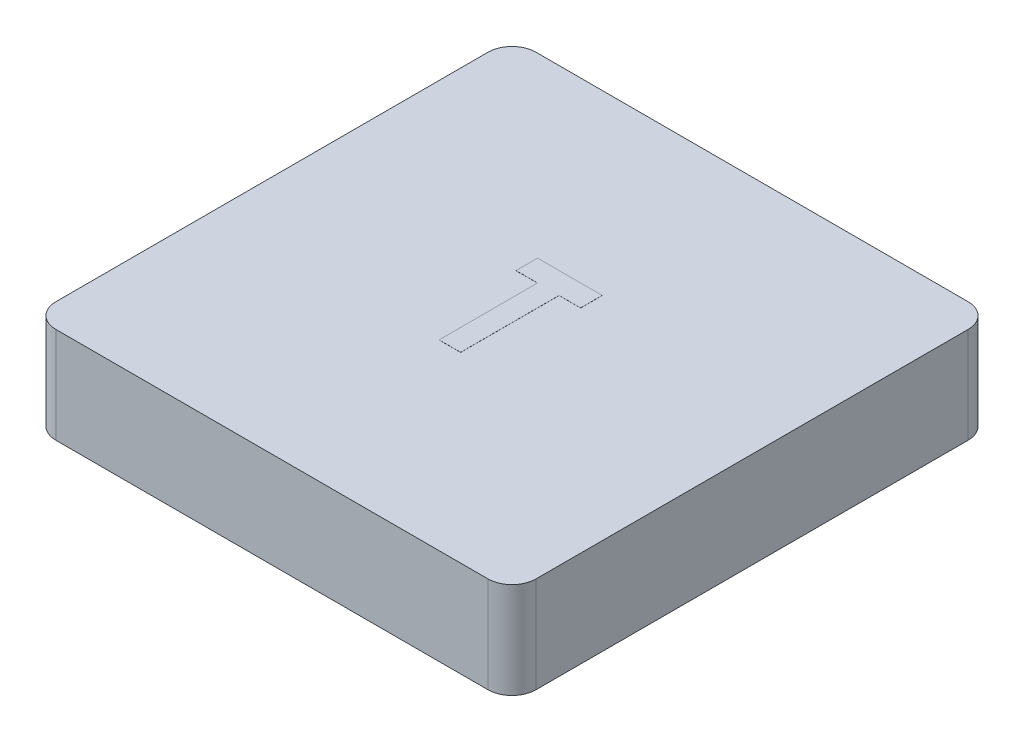
ISO-10303-21;
HEADER;
FILE_DESCRIPTION(('STEP AP214'),'2;1');
FILE_NAME('part.step','',(''),(''),'','','');
FILE_SCHEMA(('AUTOMOTIVE_DESIGN { 1 0 10303 214 1 1 1 1 }'));
ENDSEC;
DATA;
#1=APPLICATION_CONTEXT('core data for automotive mechanical design processes');
#2=APPLICATION_PROTOCOL_DEFINITION('international standard','automotive_design',2000,#1);
#3=PRODUCT_CONTEXT('',#1,'mechanical');
#4=PRODUCT('Part','Part','',(#3));
#5=PRODUCT_RELATED_PRODUCT_CATEGORY('part','',(#4));
#6=PRODUCT_DEFINITION_FORMATION('','',#4);
#7=PRODUCT_DEFINITION_CONTEXT('part definition',#1,'design');
#8=PRODUCT_DEFINITION('design','',#6,#7);
#9=PRODUCT_DEFINITION_SHAPE('','',#8);
#10=(LENGTH_UNIT() NAMED_UNIT(*) SI_UNIT(.MILLI.,.METRE.));
#11=(NAMED_UNIT(*) PLANE_ANGLE_UNIT() SI_UNIT($,.RADIAN.));
#12=(NAMED_UNIT(*) SI_UNIT($,.STERADIAN.) SOLID_ANGLE_UNIT());
#13=UNCERTAINTY_MEASURE_WITH_UNIT(LENGTH_MEASURE(1.E-05),#10,'distance_accuracy_value','');
#14=(GEOMETRIC_REPRESENTATION_CONTEXT(3) GLOBAL_UNCERTAINTY_ASSIGNED_CONTEXT((#13)) GLOBAL_UNIT_ASSIGNED_CONTEXT((#10,
#11,#12)) REPRESENTATION_CONTEXT('',''));
#15=CARTESIAN_POINT('',(0.,0.,0.));
#16=DIRECTION('',(0.,0.,1.));
#17=DIRECTION('',(1.,0.,0.));
#18=AXIS2_PLACEMENT_3D('',#15,#16,#17);
#19=CARTESIAN_POINT('',(0.,2.54,-12.7));
#20=DIRECTION('',(1.,0.,0.));
#21=DIRECTION('',(0.,0.,-1.));
#22=AXIS2_PLACEMENT_3D('',#19,#20,#21);
#23=PLANE('',#22);
#24=DIRECTION('',(0.,0.,1.));
#25=VECTOR('',#24,1.);
#26=CARTESIAN_POINT('',(0.,2.54,-12.7));
#27=LINE('',#26,#25);
#28=CARTESIAN_POINT('',(0.,2.54,-12.065));
#29=VERTEX_POINT('',#28);
#30=CARTESIAN_POINT('',(0.,2.54,-0.635));
#31=VERTEX_POINT('',#30);
#32=EDGE_CURVE('E280',#29,#31,#27,.T.);
#33=ORIENTED_EDGE('',*,*,#32,.F.);
#34=DIRECTION('',(0.,-1.,0.));
#35=VECTOR('',#34,1.);
#36=CARTESIAN_POINT('',(0.,2.54,-12.065));
#37=LINE('',#36,#35);
#38=CARTESIAN_POINT('',(0.,0.,-12.065));
#39=VERTEX_POINT('',#38);
#40=EDGE_CURVE('E305',#29,#39,#37,.T.);
#41=ORIENTED_EDGE('',*,*,#40,.T.);
#42=DIRECTION('',(0.,0.,1.));
#43=VECTOR('',#42,1.);
#44=CARTESIAN_POINT('',(0.,0.,-12.7));
#45=LINE('',#44,#43);
#46=CARTESIAN_POINT('',(0.,0.,-0.635));
#47=VERTEX_POINT('',#46);
#48=EDGE_CURVE('E260',#39,#47,#45,.T.);
#49=ORIENTED_EDGE('',*,*,#48,.T.);
#50=DIRECTION('',(0.,-1.,0.));
#51=VECTOR('',#50,1.);
#52=CARTESIAN_POINT('',(0.,2.54,-0.635));
#53=LINE('',#52,#51);
#54=EDGE_CURVE('E293',#47,#31,#53,.F.);
#55=ORIENTED_EDGE('',*,*,#54,.T.);
#56=EDGE_LOOP('',(#33,#41,#49,#55));
#57=FACE_BOUND('',#56,.T.);
#58=ADVANCED_FACE('F33',(#57),#23,.F.);
#59=CARTESIAN_POINT('',(0.,2.54,0.));
#60=DIRECTION('',(0.,0.,-1.));
#61=DIRECTION('',(-1.,0.,0.));
#62=AXIS2_PLACEMENT_3D('',#59,#60,#61);
#63=PLANE('',#62);
#64=DIRECTION('',(1.,0.,0.));
#65=VECTOR('',#64,1.);
#66=CARTESIAN_POINT('',(0.,0.,0.));
#67=LINE('',#66,#65);
#68=CARTESIAN_POINT('',(0.635,0.,0.));
#69=VERTEX_POINT('',#68);
#70=CARTESIAN_POINT('',(12.065,0.,0.));
#71=VERTEX_POINT('',#70);
#72=EDGE_CURVE('E296',#69,#71,#67,.T.);
#73=ORIENTED_EDGE('',*,*,#72,.T.);
#74=DIRECTION('',(0.,-1.,0.));
#75=VECTOR('',#74,1.);
#76=CARTESIAN_POINT('',(12.065,2.54,0.));
#77=LINE('',#76,#75);
#78=CARTESIAN_POINT('',(12.065,2.54,0.));
#79=VERTEX_POINT('',#78);
#80=EDGE_CURVE('E41',#71,#79,#77,.F.);
#81=ORIENTED_EDGE('',*,*,#80,.T.);
#82=DIRECTION('',(1.,0.,0.));
#83=VECTOR('',#82,1.);
#84=CARTESIAN_POINT('',(0.,2.54,0.));
#85=LINE('',#84,#83);
#86=CARTESIAN_POINT('',(0.635,2.54,0.));
#87=VERTEX_POINT('',#86);
#88=EDGE_CURVE('E283',#87,#79,#85,.T.);
#89=ORIENTED_EDGE('',*,*,#88,.F.);
#90=DIRECTION('',(0.,-1.,0.));
#91=VECTOR('',#90,1.);
#92=CARTESIAN_POINT('',(0.635,2.54,0.));
#93=LINE('',#92,#91);
#94=EDGE_CURVE('E334',#87,#69,#93,.T.);
#95=ORIENTED_EDGE('',*,*,#94,.T.);
#96=EDGE_LOOP('',(#73,#81,#89,#95));
#97=FACE_BOUND('',#96,.T.);
#98=ADVANCED_FACE('F339',(#97),#63,.F.);
#99=CARTESIAN_POINT('',(12.7,2.54,0.));
#100=DIRECTION('',(-1.,0.,0.));
#101=DIRECTION('',(0.,0.,1.));
#102=AXIS2_PLACEMENT_3D('',#99,#100,#101);
#103=PLANE('',#102);
#104=DIRECTION('',(0.,0.,-1.));
#105=VECTOR('',#104,1.);
#106=CARTESIAN_POINT('',(12.7,0.,0.));
#107=LINE('',#106,#105);
#108=CARTESIAN_POINT('',(12.7,0.,-0.635));
#109=VERTEX_POINT('',#108);
#110=CARTESIAN_POINT('',(12.7,0.,-12.065));
#111=VERTEX_POINT('',#110);
#112=EDGE_CURVE('E299',#109,#111,#107,.T.);
#113=ORIENTED_EDGE('',*,*,#112,.T.);
#114=DIRECTION('',(0.,-1.,0.));
#115=VECTOR('',#114,1.);
#116=CARTESIAN_POINT('',(12.7,2.54,-12.065));
#117=LINE('',#116,#115);
#118=CARTESIAN_POINT('',(12.7,2.54,-12.065));
#119=VERTEX_POINT('',#118);
#120=EDGE_CURVE('E332',#111,#119,#117,.F.);
#121=ORIENTED_EDGE('',*,*,#120,.T.);
#122=DIRECTION('',(0.,0.,-1.));
#123=VECTOR('',#122,1.);
#124=CARTESIAN_POINT('',(12.7,2.54,0.));
#125=LINE('',#124,#123);
#126=CARTESIAN_POINT('',(12.7,2.54,-0.635));
#127=VERTEX_POINT('',#126);
#128=EDGE_CURVE('E287',#127,#119,#125,.T.);
#129=ORIENTED_EDGE('',*,*,#128,.F.);
#130=DIRECTION('',(0.,-1.,0.));
#131=VECTOR('',#130,1.);
#132=CARTESIAN_POINT('',(12.7,2.54,-0.635));
#133=LINE('',#132,#131);
#134=EDGE_CURVE('E329',#127,#109,#133,.T.);
#135=ORIENTED_EDGE('',*,*,#134,.T.);
#136=EDGE_LOOP('',(#113,#121,#129,#135));
#137=FACE_BOUND('',#136,.T.);
#138=ADVANCED_FACE('F352',(#137),#103,.F.);
#139=CARTESIAN_POINT('',(12.7,2.54,-12.7));
#140=DIRECTION('',(0.,0.,1.));
#141=DIRECTION('',(1.,0.,0.));
#142=AXIS2_PLACEMENT_3D('',#139,#140,#141);
#143=PLANE('',#142);
#144=DIRECTION('',(-1.,0.,0.));
#145=VECTOR('',#144,1.);
#146=CARTESIAN_POINT('',(12.7,0.,-12.7));
#147=LINE('',#146,#145);
#148=CARTESIAN_POINT('',(12.065,0.,-12.7));
#149=VERTEX_POINT('',#148);
#150=CARTESIAN_POINT('',(0.634999999999995,0.,-12.7));
#151=VERTEX_POINT('',#150);
#152=EDGE_CURVE('E284',#149,#151,#147,.T.);
#153=ORIENTED_EDGE('',*,*,#152,.T.);
#154=DIRECTION('',(0.,-1.,0.));
#155=VECTOR('',#154,1.);
#156=CARTESIAN_POINT('',(0.634999999999995,2.54,-12.7));
#157=LINE('',#156,#155);
#158=CARTESIAN_POINT('',(0.634999999999995,2.54,-12.7));
#159=VERTEX_POINT('',#158);
#160=EDGE_CURVE('E319',#151,#159,#157,.F.);
#161=ORIENTED_EDGE('',*,*,#160,.T.);
#162=DIRECTION('',(-1.,0.,0.));
#163=VECTOR('',#162,1.);
#164=CARTESIAN_POINT('',(12.7,2.54,-12.7));
#165=LINE('',#164,#163);
#166=CARTESIAN_POINT('',(12.065,2.54,-12.7));
#167=VERTEX_POINT('',#166);
#168=EDGE_CURVE('E290',#167,#159,#165,.T.);
#169=ORIENTED_EDGE('',*,*,#168,.F.);
#170=DIRECTION('',(0.,-1.,0.));
#171=VECTOR('',#170,1.);
#172=CARTESIAN_POINT('',(12.065,2.54,-12.7));
#173=LINE('',#172,#171);
#174=EDGE_CURVE('E316',#167,#149,#173,.T.);
#175=ORIENTED_EDGE('',*,*,#174,.T.);
#176=EDGE_LOOP('',(#153,#161,#169,#175));
#177=FACE_BOUND('',#176,.T.);
#178=ADVANCED_FACE('F364',(#177),#143,.F.);
#179=CARTESIAN_POINT('',(0.,2.54,0.));
#180=DIRECTION('',(0.,1.,0.));
#181=DIRECTION('',(0.,0.,1.));
#182=AXIS2_PLACEMENT_3D('',#179,#180,#181);
#183=PLANE('',#182);
#184=DIRECTION('',(0.,0.,-1.));
#185=VECTOR('',#184,1.);
#186=CARTESIAN_POINT('',(5.37470512820512,2.54,-7.4311282051282));
#187=LINE('',#186,#185);
#188=CARTESIAN_POINT('',(5.37470512820512,2.54,-7.4311282051282));
#189=VERTEX_POINT('',#188);
#190=CARTESIAN_POINT('',(5.37470512820512,2.54,-8.001));
#191=VERTEX_POINT('',#190);
#192=EDGE_CURVE('E212',#189,#191,#187,.T.);
#193=ORIENTED_EDGE('',*,*,#192,.T.);
#194=DIRECTION('',(1.,0.,0.));
#195=VECTOR('',#194,1.);
#196=CARTESIAN_POINT('',(5.37470512820512,2.54,-8.001));
#197=LINE('',#196,#195);
#198=CARTESIAN_POINT('',(7.08432051282051,2.54,-8.001));
#199=VERTEX_POINT('',#198);
#200=EDGE_CURVE('E175',#191,#199,#197,.T.);
#201=ORIENTED_EDGE('',*,*,#200,.T.);
#202=DIRECTION('',(0.,0.,1.));
#203=VECTOR('',#202,1.);
#204=CARTESIAN_POINT('',(7.08432051282051,2.54,-8.001));
#205=LINE('',#204,#203);
#206=CARTESIAN_POINT('',(7.08432051282051,2.54,-7.4311282051282));
#207=VERTEX_POINT('',#206);
#208=EDGE_CURVE('E215',#199,#207,#205,.T.);
#209=ORIENTED_EDGE('',*,*,#208,.T.);
#210=DIRECTION('',(-1.,0.,0.));
#211=VECTOR('',#210,1.);
#212=CARTESIAN_POINT('',(7.08432051282051,2.54,-7.4311282051282));
#213=LINE('',#212,#211);
#214=CARTESIAN_POINT('',(6.51444871794871,2.54,-7.4311282051282));
#215=VERTEX_POINT('',#214);
#216=EDGE_CURVE('E217',#207,#215,#213,.T.);
#217=ORIENTED_EDGE('',*,*,#216,.T.);
#218=DIRECTION('',(0.,0.,1.));
#219=VECTOR('',#218,1.);
#220=CARTESIAN_POINT('',(6.51444871794871,2.54,-7.4311282051282));
#221=LINE('',#220,#219);
#222=CARTESIAN_POINT('',(6.51444871794871,2.54,-4.826));
#223=VERTEX_POINT('',#222);
#224=EDGE_CURVE('E219',#215,#223,#221,.T.);
#225=ORIENTED_EDGE('',*,*,#224,.T.);
#226=DIRECTION('',(-1.,0.,0.));
#227=VECTOR('',#226,1.);
#228=CARTESIAN_POINT('',(6.51444871794871,2.54,-4.826));
#229=LINE('',#228,#227);
#230=CARTESIAN_POINT('',(5.94457692307692,2.54,-4.826));
#231=VERTEX_POINT('',#230);
#232=EDGE_CURVE('E221',#223,#231,#229,.T.);
#233=ORIENTED_EDGE('',*,*,#232,.T.);
#234=DIRECTION('',(0.,0.,-1.));
#235=VECTOR('',#234,1.);
#236=CARTESIAN_POINT('',(5.94457692307692,2.54,-4.826));
#237=LINE('',#236,#235);
#238=CARTESIAN_POINT('',(5.94457692307692,2.54,-7.4311282051282));
#239=VERTEX_POINT('',#238);
#240=EDGE_CURVE('E53',#231,#239,#237,.T.);
#241=ORIENTED_EDGE('',*,*,#240,.T.);
#242=DIRECTION('',(-1.,0.,0.));
#243=VECTOR('',#242,1.);
#244=CARTESIAN_POINT('',(5.94457692307692,2.54,-7.4311282051282));
#245=LINE('',#244,#243);
#246=EDGE_CURVE('E48',#239,#189,#245,.T.);
#247=ORIENTED_EDGE('',*,*,#246,.T.);
#248=EDGE_LOOP('',(#193,#201,#209,#217,#225,#233,#241,#247));
#249=FACE_BOUND('',#248,.T.);
#250=ORIENTED_EDGE('',*,*,#168,.T.);
#251=CARTESIAN_POINT('',(0.634999999999995,2.54,-12.065));
#252=DIRECTION('',(0.,1.,0.));
#253=DIRECTION('',(0.,0.,1.));
#254=AXIS2_PLACEMENT_3D('',#251,#252,#253);
#255=CIRCLE('',#254,0.635);
#256=EDGE_CURVE('E327',#159,#29,#255,.T.);
#257=ORIENTED_EDGE('',*,*,#256,.T.);
#258=ORIENTED_EDGE('',*,*,#32,.T.);
#259=CARTESIAN_POINT('',(0.635,2.54,-0.635));
#260=DIRECTION('',(0.,1.,0.));
#261=DIRECTION('',(0.,0.,1.));
#262=AXIS2_PLACEMENT_3D('',#259,#260,#261);
#263=CIRCLE('',#262,0.635);
#264=EDGE_CURVE('E321',#31,#87,#263,.T.);
#265=ORIENTED_EDGE('',*,*,#264,.T.);
#266=ORIENTED_EDGE('',*,*,#88,.T.);
#267=CARTESIAN_POINT('',(12.065,2.54,-0.635));
#268=DIRECTION('',(0.,1.,0.));
#269=DIRECTION('',(0.,0.,1.));
#270=AXIS2_PLACEMENT_3D('',#267,#268,#269);
#271=CIRCLE('',#270,0.635);
#272=EDGE_CURVE('E323',#79,#127,#271,.T.);
#273=ORIENTED_EDGE('',*,*,#272,.T.);
#274=ORIENTED_EDGE('',*,*,#128,.T.);
#275=CARTESIAN_POINT('',(12.065,2.54,-12.065));
#276=DIRECTION('',(0.,1.,0.));
#277=DIRECTION('',(0.,0.,1.));
#278=AXIS2_PLACEMENT_3D('',#275,#276,#277);
#279=CIRCLE('',#278,0.635);
#280=EDGE_CURVE('E325',#119,#167,#279,.T.);
#281=ORIENTED_EDGE('',*,*,#280,.T.);
#282=EDGE_LOOP('',(#250,#257,#258,#265,#266,#273,#274,#281));
#283=FACE_BOUND('',#282,.T.);
#284=ADVANCED_FACE('F345',(#249,#283),#183,.T.);
#285=CARTESIAN_POINT('',(0.,0.,0.));
#286=DIRECTION('',(0.,1.,0.));
#287=DIRECTION('',(0.,0.,1.));
#288=AXIS2_PLACEMENT_3D('',#285,#286,#287);
#289=PLANE('',#288);
#290=DIRECTION('',(-1.,0.,0.));
#291=VECTOR('',#290,1.);
#292=CARTESIAN_POINT('',(12.7,0.,-12.065));
#293=LINE('',#292,#291);
#294=CARTESIAN_POINT('',(12.065,0.,-12.065));
#295=VERTEX_POINT('',#294);
#296=CARTESIAN_POINT('',(0.634999999999995,0.,-12.065));
#297=VERTEX_POINT('',#296);
#298=EDGE_CURVE('E248',#295,#297,#293,.T.);
#299=ORIENTED_EDGE('',*,*,#298,.T.);
#300=DIRECTION('',(0.,0.,1.));
#301=VECTOR('',#300,1.);
#302=CARTESIAN_POINT('',(0.634999999999995,0.,-12.7));
#303=LINE('',#302,#301);
#304=CARTESIAN_POINT('',(0.635,0.,-0.635));
#305=VERTEX_POINT('',#304);
#306=EDGE_CURVE('E243',#297,#305,#303,.T.);
#307=ORIENTED_EDGE('',*,*,#306,.T.);
#308=DIRECTION('',(1.,0.,0.));
#309=VECTOR('',#308,1.);
#310=CARTESIAN_POINT('',(0.,0.,-0.635));
#311=LINE('',#310,#309);
#312=CARTESIAN_POINT('',(12.065,0.,-0.635));
#313=VERTEX_POINT('',#312);
#314=EDGE_CURVE('E272',#305,#313,#311,.T.);
#315=ORIENTED_EDGE('',*,*,#314,.T.);
#316=DIRECTION('',(0.,0.,-1.));
#317=VECTOR('',#316,1.);
#318=CARTESIAN_POINT('',(12.065,0.,0.));
#319=LINE('',#318,#317);
#320=EDGE_CURVE('E275',#313,#295,#319,.T.);
#321=ORIENTED_EDGE('',*,*,#320,.T.);
#322=EDGE_LOOP('',(#299,#307,#315,#321));
#323=FACE_BOUND('',#322,.T.);
#324=ORIENTED_EDGE('',*,*,#48,.F.);
#325=CARTESIAN_POINT('',(0.634999999999995,0.,-12.065));
#326=DIRECTION('',(0.,1.,0.));
#327=DIRECTION('',(0.,0.,1.));
#328=AXIS2_PLACEMENT_3D('',#325,#326,#327);
#329=CIRCLE('',#328,0.635);
#330=EDGE_CURVE('E314',#39,#151,#329,.F.);
#331=ORIENTED_EDGE('',*,*,#330,.T.);
#332=ORIENTED_EDGE('',*,*,#152,.F.);
#333=CARTESIAN_POINT('',(12.065,0.,-12.065));
#334=DIRECTION('',(0.,1.,0.));
#335=DIRECTION('',(0.,0.,1.));
#336=AXIS2_PLACEMENT_3D('',#333,#334,#335);
#337=CIRCLE('',#336,0.635);
#338=EDGE_CURVE('E312',#149,#111,#337,.F.);
#339=ORIENTED_EDGE('',*,*,#338,.T.);
#340=ORIENTED_EDGE('',*,*,#112,.F.);
#341=CARTESIAN_POINT('',(12.065,0.,-0.635));
#342=DIRECTION('',(0.,1.,0.));
#343=DIRECTION('',(0.,0.,1.));
#344=AXIS2_PLACEMENT_3D('',#341,#342,#343);
#345=CIRCLE('',#344,0.635);
#346=EDGE_CURVE('E310',#109,#71,#345,.F.);
#347=ORIENTED_EDGE('',*,*,#346,.T.);
#348=ORIENTED_EDGE('',*,*,#72,.F.);
#349=CARTESIAN_POINT('',(0.635,0.,-0.635));
#350=DIRECTION('',(0.,1.,0.));
#351=DIRECTION('',(0.,0.,1.));
#352=AXIS2_PLACEMENT_3D('',#349,#350,#351);
#353=CIRCLE('',#352,0.635);
#354=EDGE_CURVE('E308',#69,#47,#353,.F.);
#355=ORIENTED_EDGE('',*,*,#354,.T.);
#356=EDGE_LOOP('',(#324,#331,#332,#339,#340,#347,#348,#355));
#357=FACE_BOUND('',#356,.T.);
#358=ADVANCED_FACE('F356',(#323,#357),#289,.F.);
#359=CARTESIAN_POINT('',(0.634999999999995,2.54,-12.065));
#360=DIRECTION('',(0.,-1.,0.));
#361=DIRECTION('',(0.,0.,-1.));
#362=AXIS2_PLACEMENT_3D('',#359,#360,#361);
#363=CYLINDRICAL_SURFACE('',#362,0.635);
#364=ORIENTED_EDGE('',*,*,#256,.F.);
#365=ORIENTED_EDGE('',*,*,#160,.F.);
#366=ORIENTED_EDGE('',*,*,#330,.F.);
#367=ORIENTED_EDGE('',*,*,#40,.F.);
#368=EDGE_LOOP('',(#364,#365,#366,#367));
#369=FACE_BOUND('',#368,.T.);
#370=ADVANCED_FACE('F370',(#369),#363,.T.);
#371=CARTESIAN_POINT('',(12.065,2.54,-12.065));
#372=DIRECTION('',(0.,-1.,0.));
#373=DIRECTION('',(0.,0.,-1.));
#374=AXIS2_PLACEMENT_3D('',#371,#372,#373);
#375=CYLINDRICAL_SURFACE('',#374,0.635);
#376=ORIENTED_EDGE('',*,*,#280,.F.);
#377=ORIENTED_EDGE('',*,*,#120,.F.);
#378=ORIENTED_EDGE('',*,*,#338,.F.);
#379=ORIENTED_EDGE('',*,*,#174,.F.);
#380=EDGE_LOOP('',(#376,#377,#378,#379));
#381=FACE_BOUND('',#380,.T.);
#382=ADVANCED_FACE('F361',(#381),#375,.T.);
#383=CARTESIAN_POINT('',(12.065,2.54,-0.635));
#384=DIRECTION('',(0.,-1.,0.));
#385=DIRECTION('',(0.,0.,-1.));
#386=AXIS2_PLACEMENT_3D('',#383,#384,#385);
#387=CYLINDRICAL_SURFACE('',#386,0.635);
#388=ORIENTED_EDGE('',*,*,#272,.F.);
#389=ORIENTED_EDGE('',*,*,#80,.F.);
#390=ORIENTED_EDGE('',*,*,#346,.F.);
#391=ORIENTED_EDGE('',*,*,#134,.F.);
#392=EDGE_LOOP('',(#388,#389,#390,#391));
#393=FACE_BOUND('',#392,.T.);
#394=ADVANCED_FACE('F349',(#393),#387,.T.);
#395=CARTESIAN_POINT('',(0.635,2.54,-0.635));
#396=DIRECTION('',(0.,-1.,0.));
#397=DIRECTION('',(0.,0.,-1.));
#398=AXIS2_PLACEMENT_3D('',#395,#396,#397);
#399=CYLINDRICAL_SURFACE('',#398,0.635);
#400=ORIENTED_EDGE('',*,*,#264,.F.);
#401=ORIENTED_EDGE('',*,*,#54,.F.);
#402=ORIENTED_EDGE('',*,*,#354,.F.);
#403=ORIENTED_EDGE('',*,*,#94,.F.);
#404=EDGE_LOOP('',(#400,#401,#402,#403));
#405=FACE_BOUND('',#404,.T.);
#406=ADVANCED_FACE('F35',(#405),#399,.T.);
#407=CARTESIAN_POINT('',(0.634999999999995,2.54,-12.7));
#408=DIRECTION('',(1.,0.,0.));
#409=DIRECTION('',(0.,0.,-1.));
#410=AXIS2_PLACEMENT_3D('',#407,#408,#409);
#411=PLANE('',#410);
#412=DIRECTION('',(0.,0.,1.));
#413=VECTOR('',#412,1.);
#414=CARTESIAN_POINT('',(0.634999999999995,1.905,-12.7));
#415=LINE('',#414,#413);
#416=CARTESIAN_POINT('',(0.634999999999995,1.905,-12.065));
#417=VERTEX_POINT('',#416);
#418=CARTESIAN_POINT('',(0.635,1.905,-0.635));
#419=VERTEX_POINT('',#418);
#420=EDGE_CURVE('E244',#417,#419,#415,.T.);
#421=ORIENTED_EDGE('',*,*,#420,.T.);
#422=DIRECTION('',(0.,1.,0.));
#423=VECTOR('',#422,1.);
#424=CARTESIAN_POINT('',(0.635,2.54,-0.635));
#425=LINE('',#424,#423);
#426=EDGE_CURVE('E253',#305,#419,#425,.T.);
#427=ORIENTED_EDGE('',*,*,#426,.F.);
#428=ORIENTED_EDGE('',*,*,#306,.F.);
#429=DIRECTION('',(0.,1.,0.));
#430=VECTOR('',#429,1.);
#431=CARTESIAN_POINT('',(0.634999999999995,2.54,-12.065));
#432=LINE('',#431,#430);
#433=EDGE_CURVE('E249',#297,#417,#432,.T.);
#434=ORIENTED_EDGE('',*,*,#433,.T.);
#435=EDGE_LOOP('',(#421,#427,#428,#434));
#436=FACE_BOUND('',#435,.T.);
#437=ADVANCED_FACE('F375',(#436),#411,.T.);
#438=CARTESIAN_POINT('',(0.,2.54,-0.635));
#439=DIRECTION('',(0.,0.,-1.));
#440=DIRECTION('',(-1.,0.,0.));
#441=AXIS2_PLACEMENT_3D('',#438,#439,#440);
#442=PLANE('',#441);
#443=ORIENTED_EDGE('',*,*,#314,.F.);
#444=ORIENTED_EDGE('',*,*,#426,.T.);
#445=DIRECTION('',(1.,0.,0.));
#446=VECTOR('',#445,1.);
#447=CARTESIAN_POINT('',(0.,1.905,-0.635));
#448=LINE('',#447,#446);
#449=CARTESIAN_POINT('',(12.065,1.905,-0.635));
#450=VERTEX_POINT('',#449);
#451=EDGE_CURVE('E247',#419,#450,#448,.T.);
#452=ORIENTED_EDGE('',*,*,#451,.T.);
#453=DIRECTION('',(0.,1.,0.));
#454=VECTOR('',#453,1.);
#455=CARTESIAN_POINT('',(12.065,2.54,-0.635));
#456=LINE('',#455,#454);
#457=EDGE_CURVE('E257',#313,#450,#456,.T.);
#458=ORIENTED_EDGE('',*,*,#457,.F.);
#459=EDGE_LOOP('',(#443,#444,#452,#458));
#460=FACE_BOUND('',#459,.T.);
#461=ADVANCED_FACE('F380',(#460),#442,.T.);
#462=CARTESIAN_POINT('',(12.065,2.54,0.));
#463=DIRECTION('',(-1.,0.,0.));
#464=DIRECTION('',(0.,0.,1.));
#465=AXIS2_PLACEMENT_3D('',#462,#463,#464);
#466=PLANE('',#465);
#467=ORIENTED_EDGE('',*,*,#320,.F.);
#468=ORIENTED_EDGE('',*,*,#457,.T.);
#469=DIRECTION('',(0.,0.,-1.));
#470=VECTOR('',#469,1.);
#471=CARTESIAN_POINT('',(12.065,1.905,0.));
#472=LINE('',#471,#470);
#473=CARTESIAN_POINT('',(12.065,1.905,-12.065));
#474=VERTEX_POINT('',#473);
#475=EDGE_CURVE('E263',#450,#474,#472,.T.);
#476=ORIENTED_EDGE('',*,*,#475,.T.);
#477=DIRECTION('',(0.,1.,0.));
#478=VECTOR('',#477,1.);
#479=CARTESIAN_POINT('',(12.065,2.54,-12.065));
#480=LINE('',#479,#478);
#481=EDGE_CURVE('E252',#295,#474,#480,.T.);
#482=ORIENTED_EDGE('',*,*,#481,.F.);
#483=EDGE_LOOP('',(#467,#468,#476,#482));
#484=FACE_BOUND('',#483,.T.);
#485=ADVANCED_FACE('F433',(#484),#466,.T.);
#486=CARTESIAN_POINT('',(12.7,2.54,-12.065));
#487=DIRECTION('',(0.,0.,1.));
#488=DIRECTION('',(1.,0.,0.));
#489=AXIS2_PLACEMENT_3D('',#486,#487,#488);
#490=PLANE('',#489);
#491=ORIENTED_EDGE('',*,*,#298,.F.);
#492=ORIENTED_EDGE('',*,*,#481,.T.);
#493=DIRECTION('',(-1.,0.,0.));
#494=VECTOR('',#493,1.);
#495=CARTESIAN_POINT('',(12.7,1.905,-12.065));
#496=LINE('',#495,#494);
#497=EDGE_CURVE('E256',#474,#417,#496,.T.);
#498=ORIENTED_EDGE('',*,*,#497,.T.);
#499=ORIENTED_EDGE('',*,*,#433,.F.);
#500=EDGE_LOOP('',(#491,#492,#498,#499));
#501=FACE_BOUND('',#500,.T.);
#502=ADVANCED_FACE('F443',(#501),#490,.T.);
#503=CARTESIAN_POINT('',(0.,1.905,0.));
#504=DIRECTION('',(0.,1.,0.));
#505=DIRECTION('',(0.,0.,1.));
#506=AXIS2_PLACEMENT_3D('',#503,#504,#505);
#507=PLANE('',#506);
#508=CARTESIAN_POINT('',(6.34999999999999,1.905,-6.35));
#509=DIRECTION('',(0.,1.,0.));
#510=DIRECTION('',(0.,0.,1.));
#511=AXIS2_PLACEMENT_3D('',#508,#509,#510);
#512=CIRCLE('',#511,2.54);
#513=CARTESIAN_POINT('',(6.34999999999999,1.905,-3.81));
#514=VERTEX_POINT('',#513);
#515=EDGE_CURVE('E11',#514,#514,#512,.F.);
#516=ORIENTED_EDGE('',*,*,#515,.F.);
#517=EDGE_LOOP('',(#516));
#518=FACE_BOUND('',#517,.T.);
#519=ORIENTED_EDGE('',*,*,#497,.F.);
#520=ORIENTED_EDGE('',*,*,#475,.F.);
#521=ORIENTED_EDGE('',*,*,#451,.F.);
#522=ORIENTED_EDGE('',*,*,#420,.F.);
#523=EDGE_LOOP('',(#519,#520,#521,#522));
#524=FACE_BOUND('',#523,.T.);
#525=ADVANCED_FACE('F453',(#518,#524),#507,.F.);
#526=CARTESIAN_POINT('',(6.34999999999999,-7.18420489685532,-6.35));
#527=DIRECTION('',(0.,1.,0.));
#528=DIRECTION('',(0.,0.,1.));
#529=AXIS2_PLACEMENT_3D('',#526,#527,#528);
#530=CYLINDRICAL_SURFACE('',#529,2.54);
#531=CARTESIAN_POINT('',(6.34999999999999,0.,-6.35));
#532=DIRECTION('',(0.,1.,0.));
#533=DIRECTION('',(0.,0.,1.));
#534=AXIS2_PLACEMENT_3D('',#531,#532,#533);
#535=CIRCLE('',#534,2.54);
#536=CARTESIAN_POINT('',(6.34999999999999,0.,-3.81));
#537=VERTEX_POINT('',#536);
#538=EDGE_CURVE('E225',#537,#537,#535,.T.);
#539=CARTESIAN_POINT('',(6.34999999999999,0.,-3.81));
#540=CARTESIAN_POINT('',(6.34999999999999,0.0198437499999991,-3.81));
#541=CARTESIAN_POINT('',(6.34999999999999,0.0396874999999989,-3.81));
#542=CARTESIAN_POINT('',(6.34999999999999,0.079374999999999,-3.81));
#543=CARTESIAN_POINT('',(6.34999999999999,0.0992187499999992,-3.81));
#544=CARTESIAN_POINT('',(6.34999999999999,0.138906249999999,-3.81));
#545=CARTESIAN_POINT('',(6.34999999999999,0.158749999999999,-3.81));
#546=CARTESIAN_POINT('',(6.34999999999999,0.198437499999999,-3.81));
#547=CARTESIAN_POINT('',(6.34999999999999,0.218281249999999,-3.81));
#548=CARTESIAN_POINT('',(6.34999999999999,0.25796875,-3.81));
#549=CARTESIAN_POINT('',(6.34999999999999,0.277812499999999,-3.81));
#550=CARTESIAN_POINT('',(6.34999999999999,0.317499999999999,-3.81));
#551=CARTESIAN_POINT('',(6.34999999999999,0.337343749999999,-3.81));
#552=CARTESIAN_POINT('',(6.34999999999999,0.377031249999999,-3.81));
#553=CARTESIAN_POINT('',(6.34999999999999,0.396874999999999,-3.81));
#554=CARTESIAN_POINT('',(6.34999999999999,0.436562499999999,-3.81));
#555=CARTESIAN_POINT('',(6.34999999999999,0.456406249999999,-3.81));
#556=CARTESIAN_POINT('',(6.34999999999999,0.496093749999999,-3.81));
#557=CARTESIAN_POINT('',(6.34999999999999,0.515937499999999,-3.81));
#558=CARTESIAN_POINT('',(6.34999999999999,0.555624999999999,-3.81));
#559=CARTESIAN_POINT('',(6.34999999999999,0.575468749999999,-3.81));
#560=CARTESIAN_POINT('',(6.34999999999999,0.615156249999999,-3.81));
#561=CARTESIAN_POINT('',(6.34999999999999,0.634999999999999,-3.81));
#562=CARTESIAN_POINT('',(6.34999999999999,0.674687499999998,-3.81));
#563=CARTESIAN_POINT('',(6.34999999999999,0.694531249999998,-3.81));
#564=CARTESIAN_POINT('',(6.34999999999999,0.734218749999998,-3.81));
#565=CARTESIAN_POINT('',(6.34999999999999,0.754062499999998,-3.81));
#566=CARTESIAN_POINT('',(6.34999999999999,0.793749999999998,-3.81));
#567=CARTESIAN_POINT('',(6.34999999999999,0.813593749999999,-3.81));
#568=CARTESIAN_POINT('',(6.34999999999999,0.853281249999999,-3.81));
#569=CARTESIAN_POINT('',(6.34999999999999,0.873124999999999,-3.81));
#570=CARTESIAN_POINT('',(6.34999999999999,0.912812499999999,-3.81));
#571=CARTESIAN_POINT('',(6.34999999999999,0.932656249999999,-3.81));
#572=CARTESIAN_POINT('',(6.34999999999999,0.972343749999998,-3.81));
#573=CARTESIAN_POINT('',(6.34999999999999,0.992187499999998,-3.81));
#574=CARTESIAN_POINT('',(6.34999999999999,1.031875,-3.81));
#575=CARTESIAN_POINT('',(6.34999999999999,1.05171875,-3.81));
#576=CARTESIAN_POINT('',(6.34999999999999,1.09140625,-3.81));
#577=CARTESIAN_POINT('',(6.34999999999999,1.11125,-3.81));
#578=CARTESIAN_POINT('',(6.34999999999999,1.1509375,-3.81));
#579=CARTESIAN_POINT('',(6.34999999999999,1.17078125,-3.81));
#580=CARTESIAN_POINT('',(6.34999999999999,1.21046875,-3.81));
#581=CARTESIAN_POINT('',(6.34999999999999,1.2303125,-3.81));
#582=CARTESIAN_POINT('',(6.34999999999999,1.27,-3.81));
#583=CARTESIAN_POINT('',(6.34999999999999,1.28984375,-3.81));
#584=CARTESIAN_POINT('',(6.34999999999999,1.32953125,-3.81));
#585=CARTESIAN_POINT('',(6.34999999999999,1.349375,-3.81));
#586=CARTESIAN_POINT('',(6.34999999999999,1.3890625,-3.81));
#587=CARTESIAN_POINT('',(6.34999999999999,1.40890625,-3.81));
#588=CARTESIAN_POINT('',(6.34999999999999,1.44859375,-3.81));
#589=CARTESIAN_POINT('',(6.34999999999999,1.4684375,-3.81));
#590=CARTESIAN_POINT('',(6.34999999999999,1.508125,-3.81));
#591=CARTESIAN_POINT('',(6.34999999999999,1.52796875,-3.81));
#592=CARTESIAN_POINT('',(6.34999999999999,1.56765625,-3.81));
#593=CARTESIAN_POINT('',(6.34999999999999,1.5875,-3.81));
#594=CARTESIAN_POINT('',(6.34999999999999,1.6271875,-3.81));
#595=CARTESIAN_POINT('',(6.34999999999999,1.64703125,-3.81));
#596=CARTESIAN_POINT('',(6.34999999999999,1.68671875,-3.81));
#597=CARTESIAN_POINT('',(6.34999999999999,1.7065625,-3.81));
#598=CARTESIAN_POINT('',(6.34999999999999,1.74625,-3.81));
#599=CARTESIAN_POINT('',(6.34999999999999,1.76609375,-3.81));
#600=CARTESIAN_POINT('',(6.34999999999999,1.80578125,-3.81));
#601=CARTESIAN_POINT('',(6.34999999999999,1.825625,-3.81));
#602=CARTESIAN_POINT('',(6.34999999999999,1.8653125,-3.81));
#603=CARTESIAN_POINT('',(6.34999999999999,1.88515625,-3.81));
#604=CARTESIAN_POINT('',(6.34999999999999,1.905,-3.81));
#605=B_SPLINE_CURVE_WITH_KNOTS('',3,(#539,#540,#541,#542,#543,#544,#545,#546,#547,#548,#549,
#550,#551,#552,#553,#554,#555,#556,#557,#558,#559,#560,#561,#562,#563,#564,#565,#566,#567,#568,
#569,#570,#571,#572,#573,#574,#575,#576,#577,#578,#579,#580,#581,#582,#583,#584,#585,#586,#587,
#588,#589,#590,#591,#592,#593,#594,#595,#596,#597,#598,#599,#600,#601,#602,#603,#604),
.UNSPECIFIED.,.F.,.F.,(4,2,2,2,2,2,2,2,2,2,2,2,2,2,2,2,2,2,2,2,2,2,2,2,2,2,2,2,2,2,2,2,4),(0.,
0.0595312499999997,0.1190625,0.17859375,0.238125,0.29765625,0.3571875,0.41671875,0.47625,
0.53578125,0.5953125,0.654843749999999,0.714374999999999,0.773906249999999,0.8334375,0.89296875,
0.952499999999999,1.01203125,1.0715625,1.13109375,1.190625,1.25015625,1.3096875,1.36921875,
1.42875,1.48828125,1.5478125,1.60734375,1.666875,1.72640625,1.7859375,1.84546875,1.905),.UNSPECIFIED.);
#606=EDGE_CURVE('BSEAM463',#537,#514,#605,.T.);
#607=ORIENTED_EDGE('',*,*,#538,.T.);
#608=ORIENTED_EDGE('',*,*,#515,.T.);
#609=ORIENTED_EDGE('',*,*,#606,.T.);
#610=ORIENTED_EDGE('',*,*,#606,.F.);
#611=EDGE_LOOP('',(#607,#609,#608,#610));
#612=FACE_BOUND('',#611,.T.);
#613=ADVANCED_FACE('F463',(#612),#530,.T.);
#614=CARTESIAN_POINT('',(0.,0.,0.));
#615=DIRECTION('',(0.,1.,0.));
#616=DIRECTION('',(0.,0.,1.));
#617=AXIS2_PLACEMENT_3D('',#614,#615,#616);
#618=PLANE('',#617);
#619=ORIENTED_EDGE('',*,*,#538,.F.);
#620=EDGE_LOOP('',(#619));
#621=FACE_BOUND('',#620,.T.);
#622=ADVANCED_FACE('F473',(#621),#618,.F.);
#623=CARTESIAN_POINT('',(5.37470512820512,2.54254,-7.4311282051282));
#624=DIRECTION('',(-1.,0.,0.));
#625=DIRECTION('',(0.,0.,1.));
#626=AXIS2_PLACEMENT_3D('',#623,#624,#625);
#627=PLANE('',#626);
#628=ORIENTED_EDGE('',*,*,#192,.F.);
#629=DIRECTION('',(0.,-1.,0.));
#630=VECTOR('',#629,1.);
#631=CARTESIAN_POINT('',(5.37470512820512,2.54254,-7.4311282051282));
#632=LINE('',#631,#630);
#633=CARTESIAN_POINT('',(5.37470512820512,2.54254,-7.4311282051282));
#634=VERTEX_POINT('',#633);
#635=EDGE_CURVE('E194',#634,#189,#632,.T.);
#636=ORIENTED_EDGE('',*,*,#635,.F.);
#637=DIRECTION('',(0.,0.,-1.));
#638=VECTOR('',#637,1.);
#639=CARTESIAN_POINT('',(5.37470512820512,2.54254,-7.4311282051282));
#640=LINE('',#639,#638);
#641=CARTESIAN_POINT('',(5.37470512820512,2.54254,-8.001));
#642=VERTEX_POINT('',#641);
#643=EDGE_CURVE('E187',#634,#642,#640,.T.);
#644=ORIENTED_EDGE('',*,*,#643,.T.);
#645=DIRECTION('',(0.,-1.,0.));
#646=VECTOR('',#645,1.);
#647=CARTESIAN_POINT('',(5.37470512820512,2.54254,-8.001));
#648=LINE('',#647,#646);
#649=EDGE_CURVE('E170',#642,#191,#648,.T.);
#650=ORIENTED_EDGE('',*,*,#649,.T.);
#651=EDGE_LOOP('',(#628,#636,#644,#650));
#652=FACE_BOUND('',#651,.T.);
#653=ADVANCED_FACE('F193',(#652),#627,.T.);
#654=CARTESIAN_POINT('',(5.94457692307692,2.54254,-7.4311282051282));
#655=DIRECTION('',(0.,0.,1.));
#656=DIRECTION('',(1.,0.,0.));
#657=AXIS2_PLACEMENT_3D('',#654,#655,#656);
#658=PLANE('',#657);
#659=ORIENTED_EDGE('',*,*,#246,.F.);
#660=DIRECTION('',(0.,-1.,0.));
#661=VECTOR('',#660,1.);
#662=CARTESIAN_POINT('',(5.94457692307692,2.54254,-7.4311282051282));
#663=LINE('',#662,#661);
#664=CARTESIAN_POINT('',(5.94457692307692,2.54254,-7.4311282051282));
#665=VERTEX_POINT('',#664);
#666=EDGE_CURVE('E226',#665,#239,#663,.T.);
#667=ORIENTED_EDGE('',*,*,#666,.F.);
#668=DIRECTION('',(-1.,0.,0.));
#669=VECTOR('',#668,1.);
#670=CARTESIAN_POINT('',(5.94457692307692,2.54254,-7.4311282051282));
#671=LINE('',#670,#669);
#672=EDGE_CURVE('E180',#665,#634,#671,.T.);
#673=ORIENTED_EDGE('',*,*,#672,.T.);
#674=ORIENTED_EDGE('',*,*,#635,.T.);
#675=EDGE_LOOP('',(#659,#667,#673,#674));
#676=FACE_BOUND('',#675,.T.);
#677=ADVANCED_FACE('F500',(#676),#658,.T.);
#678=CARTESIAN_POINT('',(5.94457692307692,2.54254,-4.826));
#679=DIRECTION('',(-1.,0.,0.));
#680=DIRECTION('',(0.,0.,1.));
#681=AXIS2_PLACEMENT_3D('',#678,#679,#680);
#682=PLANE('',#681);
#683=ORIENTED_EDGE('',*,*,#240,.F.);
#684=DIRECTION('',(0.,-1.,0.));
#685=VECTOR('',#684,1.);
#686=CARTESIAN_POINT('',(5.94457692307692,2.54254,-4.826));
#687=LINE('',#686,#685);
#688=CARTESIAN_POINT('',(5.94457692307692,2.54254,-4.826));
#689=VERTEX_POINT('',#688);
#690=EDGE_CURVE('E228',#689,#231,#687,.T.);
#691=ORIENTED_EDGE('',*,*,#690,.F.);
#692=DIRECTION('',(0.,0.,-1.));
#693=VECTOR('',#692,1.);
#694=CARTESIAN_POINT('',(5.94457692307692,2.54254,-4.826));
#695=LINE('',#694,#693);
#696=EDGE_CURVE('E208',#689,#665,#695,.T.);
#697=ORIENTED_EDGE('',*,*,#696,.T.);
#698=ORIENTED_EDGE('',*,*,#666,.T.);
#699=EDGE_LOOP('',(#683,#691,#697,#698));
#700=FACE_BOUND('',#699,.T.);
#701=ADVANCED_FACE('F509',(#700),#682,.T.);
#702=CARTESIAN_POINT('',(6.51444871794871,2.54254,-4.826));
#703=DIRECTION('',(0.,0.,1.));
#704=DIRECTION('',(1.,0.,0.));
#705=AXIS2_PLACEMENT_3D('',#702,#703,#704);
#706=PLANE('',#705);
#707=ORIENTED_EDGE('',*,*,#232,.F.);
#708=DIRECTION('',(0.,-1.,0.));
#709=VECTOR('',#708,1.);
#710=CARTESIAN_POINT('',(6.51444871794871,2.54254,-4.826));
#711=LINE('',#710,#709);
#712=CARTESIAN_POINT('',(6.51444871794871,2.54254,-4.826));
#713=VERTEX_POINT('',#712);
#714=EDGE_CURVE('E231',#713,#223,#711,.T.);
#715=ORIENTED_EDGE('',*,*,#714,.F.);
#716=DIRECTION('',(-1.,0.,0.));
#717=VECTOR('',#716,1.);
#718=CARTESIAN_POINT('',(6.51444871794871,2.54254,-4.826));
#719=LINE('',#718,#717);
#720=EDGE_CURVE('E205',#713,#689,#719,.T.);
#721=ORIENTED_EDGE('',*,*,#720,.T.);
#722=ORIENTED_EDGE('',*,*,#690,.T.);
#723=EDGE_LOOP('',(#707,#715,#721,#722));
#724=FACE_BOUND('',#723,.T.);
#725=ADVANCED_FACE('F519',(#724),#706,.T.);
#726=CARTESIAN_POINT('',(6.51444871794871,2.54254,-7.4311282051282));
#727=DIRECTION('',(1.,0.,0.));
#728=DIRECTION('',(0.,0.,-1.));
#729=AXIS2_PLACEMENT_3D('',#726,#727,#728);
#730=PLANE('',#729);
#731=ORIENTED_EDGE('',*,*,#224,.F.);
#732=DIRECTION('',(0.,-1.,0.));
#733=VECTOR('',#732,1.);
#734=CARTESIAN_POINT('',(6.51444871794871,2.54254,-7.4311282051282));
#735=LINE('',#734,#733);
#736=CARTESIAN_POINT('',(6.51444871794871,2.54254,-7.4311282051282));
#737=VERTEX_POINT('',#736);
#738=EDGE_CURVE('E234',#737,#215,#735,.T.);
#739=ORIENTED_EDGE('',*,*,#738,.F.);
#740=DIRECTION('',(0.,0.,1.));
#741=VECTOR('',#740,1.);
#742=CARTESIAN_POINT('',(6.51444871794871,2.54254,-7.4311282051282));
#743=LINE('',#742,#741);
#744=EDGE_CURVE('E202',#737,#713,#743,.T.);
#745=ORIENTED_EDGE('',*,*,#744,.T.);
#746=ORIENTED_EDGE('',*,*,#714,.T.);
#747=EDGE_LOOP('',(#731,#739,#745,#746));
#748=FACE_BOUND('',#747,.T.);
#749=ADVANCED_FACE('F529',(#748),#730,.T.);
#750=CARTESIAN_POINT('',(7.08432051282051,2.54254,-7.4311282051282));
#751=DIRECTION('',(0.,0.,1.));
#752=DIRECTION('',(1.,0.,0.));
#753=AXIS2_PLACEMENT_3D('',#750,#751,#752);
#754=PLANE('',#753);
#755=ORIENTED_EDGE('',*,*,#216,.F.);
#756=DIRECTION('',(0.,-1.,0.));
#757=VECTOR('',#756,1.);
#758=CARTESIAN_POINT('',(7.08432051282051,2.54254,-7.4311282051282));
#759=LINE('',#758,#757);
#760=CARTESIAN_POINT('',(7.08432051282051,2.54254,-7.4311282051282));
#761=VERTEX_POINT('',#760);
#762=EDGE_CURVE('E237',#761,#207,#759,.T.);
#763=ORIENTED_EDGE('',*,*,#762,.F.);
#764=DIRECTION('',(-1.,0.,0.));
#765=VECTOR('',#764,1.);
#766=CARTESIAN_POINT('',(7.08432051282051,2.54254,-7.4311282051282));
#767=LINE('',#766,#765);
#768=EDGE_CURVE('E199',#761,#737,#767,.T.);
#769=ORIENTED_EDGE('',*,*,#768,.T.);
#770=ORIENTED_EDGE('',*,*,#738,.T.);
#771=EDGE_LOOP('',(#755,#763,#769,#770));
#772=FACE_BOUND('',#771,.T.);
#773=ADVANCED_FACE('F539',(#772),#754,.T.);
#774=CARTESIAN_POINT('',(7.08432051282051,2.54254,-8.001));
#775=DIRECTION('',(1.,0.,0.));
#776=DIRECTION('',(0.,0.,-1.));
#777=AXIS2_PLACEMENT_3D('',#774,#775,#776);
#778=PLANE('',#777);
#779=ORIENTED_EDGE('',*,*,#208,.F.);
#780=DIRECTION('',(0.,-1.,0.));
#781=VECTOR('',#780,1.);
#782=CARTESIAN_POINT('',(7.08432051282051,2.54254,-8.001));
#783=LINE('',#782,#781);
#784=CARTESIAN_POINT('',(7.08432051282051,2.54254,-8.001));
#785=VERTEX_POINT('',#784);
#786=EDGE_CURVE('E179',#785,#199,#783,.T.);
#787=ORIENTED_EDGE('',*,*,#786,.F.);
#788=DIRECTION('',(0.,0.,1.));
#789=VECTOR('',#788,1.);
#790=CARTESIAN_POINT('',(7.08432051282051,2.54254,-8.001));
#791=LINE('',#790,#789);
#792=EDGE_CURVE('E191',#785,#761,#791,.T.);
#793=ORIENTED_EDGE('',*,*,#792,.T.);
#794=ORIENTED_EDGE('',*,*,#762,.T.);
#795=EDGE_LOOP('',(#779,#787,#793,#794));
#796=FACE_BOUND('',#795,.T.);
#797=ADVANCED_FACE('F549',(#796),#778,.T.);
#798=CARTESIAN_POINT('',(5.37470512820512,2.54254,-8.001));
#799=DIRECTION('',(0.,0.,-1.));
#800=DIRECTION('',(-1.,0.,0.));
#801=AXIS2_PLACEMENT_3D('',#798,#799,#800);
#802=PLANE('',#801);
#803=ORIENTED_EDGE('',*,*,#200,.F.);
#804=ORIENTED_EDGE('',*,*,#649,.F.);
#805=DIRECTION('',(1.,0.,0.));
#806=VECTOR('',#805,1.);
#807=CARTESIAN_POINT('',(5.37470512820512,2.54254,-8.001));
#808=LINE('',#807,#806);
#809=EDGE_CURVE('E174',#642,#785,#808,.T.);
#810=ORIENTED_EDGE('',*,*,#809,.T.);
#811=ORIENTED_EDGE('',*,*,#786,.T.);
#812=EDGE_LOOP('',(#803,#804,#810,#811));
#813=FACE_BOUND('',#812,.T.);
#814=ADVANCED_FACE('F172',(#813),#802,.T.);
#815=CARTESIAN_POINT('',(0.,2.54254,0.));
#816=DIRECTION('',(0.,-1.,0.));
#817=DIRECTION('',(0.,0.,-1.));
#818=AXIS2_PLACEMENT_3D('',#815,#816,#817);
#819=PLANE('',#818);
#820=ORIENTED_EDGE('',*,*,#643,.F.);
#821=ORIENTED_EDGE('',*,*,#672,.F.);
#822=ORIENTED_EDGE('',*,*,#696,.F.);
#823=ORIENTED_EDGE('',*,*,#720,.F.);
#824=ORIENTED_EDGE('',*,*,#744,.F.);
#825=ORIENTED_EDGE('',*,*,#768,.F.);
#826=ORIENTED_EDGE('',*,*,#792,.F.);
#827=ORIENTED_EDGE('',*,*,#809,.F.);
#828=EDGE_LOOP('',(#820,#821,#822,#823,#824,#825,#826,#827));
#829=FACE_BOUND('',#828,.T.);
#830=ADVANCED_FACE('F185',(#829),#819,.F.);
#831=CLOSED_SHELL('',(#58,#98,#138,#178,#284,#358,#370,#382,#394,#406,#437,#461,#485,#502,#525,
#613,#622,#653,#677,#701,#725,#749,#773,#797,#814,#830));
#832=MANIFOLD_SOLID_BREP('B2',#831);
#833=ADVANCED_BREP_SHAPE_REPRESENTATION('',(#18,#832),#14);
#834=SHAPE_DEFINITION_REPRESENTATION(#9,#833);
ENDSEC;
END-ISO-10303-21;
